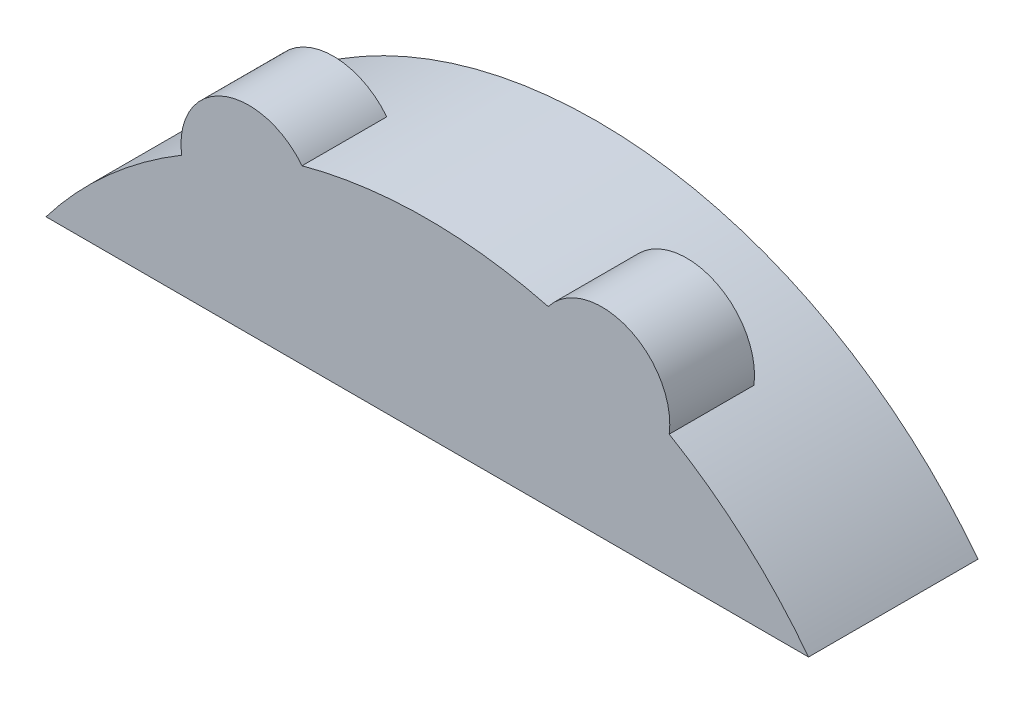
ISO-10303-21;
HEADER;
FILE_DESCRIPTION(('STEP AP214'),'2;1');
FILE_NAME('part.step','',(''),(''),'','','');
FILE_SCHEMA(('AUTOMOTIVE_DESIGN { 1 0 10303 214 1 1 1 1 }'));
ENDSEC;
DATA;
#1=APPLICATION_CONTEXT('core data for automotive mechanical design processes');
#2=APPLICATION_PROTOCOL_DEFINITION('international standard','automotive_design',2000,#1);
#3=PRODUCT_CONTEXT('',#1,'mechanical');
#4=PRODUCT('Part','Part','',(#3));
#5=PRODUCT_RELATED_PRODUCT_CATEGORY('part','',(#4));
#6=PRODUCT_DEFINITION_FORMATION('','',#4);
#7=PRODUCT_DEFINITION_CONTEXT('part definition',#1,'design');
#8=PRODUCT_DEFINITION('design','',#6,#7);
#9=PRODUCT_DEFINITION_SHAPE('','',#8);
#10=(LENGTH_UNIT() NAMED_UNIT(*) SI_UNIT(.MILLI.,.METRE.));
#11=(NAMED_UNIT(*) PLANE_ANGLE_UNIT() SI_UNIT($,.RADIAN.));
#12=(NAMED_UNIT(*) SI_UNIT($,.STERADIAN.) SOLID_ANGLE_UNIT());
#13=UNCERTAINTY_MEASURE_WITH_UNIT(LENGTH_MEASURE(1.E-05),#10,'distance_accuracy_value','');
#14=(GEOMETRIC_REPRESENTATION_CONTEXT(3) GLOBAL_UNCERTAINTY_ASSIGNED_CONTEXT((#13)) GLOBAL_UNIT_ASSIGNED_CONTEXT((#10,
#11,#12)) REPRESENTATION_CONTEXT('',''));
#15=CARTESIAN_POINT('',(0.,0.,0.));
#16=DIRECTION('',(0.,0.,1.));
#17=DIRECTION('',(1.,0.,0.));
#18=AXIS2_PLACEMENT_3D('',#15,#16,#17);
#19=CARTESIAN_POINT('',(5.,0.721726997994755,-20.));
#20=DIRECTION('',(0.,0.,1.));
#21=DIRECTION('',(1.,0.,0.));
#22=AXIS2_PLACEMENT_3D('',#19,#20,#21);
#23=CYLINDRICAL_SURFACE('',#22,56.5685424949238);
#24=DIRECTION('',(0.,0.,1.));
#25=VECTOR('',#24,1.);
#26=CARTESIAN_POINT('',(-9.78201315305642,55.3247680043606,-10.));
#27=LINE('',#26,#25);
#28=CARTESIAN_POINT('',(-9.78201315305642,55.3247680043606,-10.));
#29=VERTEX_POINT('',#28);
#30=CARTESIAN_POINT('',(-9.78201315305642,55.3247680043606,0.));
#31=VERTEX_POINT('',#30);
#32=EDGE_CURVE('E112',#29,#31,#27,.T.);
#33=ORIENTED_EDGE('',*,*,#32,.T.);
#34=CARTESIAN_POINT('',(5.,0.721726997994755,0.));
#35=DIRECTION('',(0.,0.,1.));
#36=DIRECTION('',(-1.,0.,0.));
#37=AXIS2_PLACEMENT_3D('',#34,#35,#36);
#38=CIRCLE('',#37,56.5685424949238);
#39=CARTESIAN_POINT('',(19.2743752444987,55.4596682396897,0.));
#40=VERTEX_POINT('',#39);
#41=EDGE_CURVE('E149',#40,#31,#38,.T.);
#42=ORIENTED_EDGE('',*,*,#41,.F.);
#43=DIRECTION('',(0.,0.,1.));
#44=VECTOR('',#43,1.);
#45=CARTESIAN_POINT('',(19.2743752444987,55.4596682396897,-10.));
#46=LINE('',#45,#44);
#47=CARTESIAN_POINT('',(19.2743752444987,55.4596682396897,-10.));
#48=VERTEX_POINT('',#47);
#49=EDGE_CURVE('E123',#48,#40,#46,.T.);
#50=ORIENTED_EDGE('',*,*,#49,.F.);
#51=CARTESIAN_POINT('',(5.,0.721726997994755,-10.));
#52=DIRECTION('',(0.,0.,-1.));
#53=DIRECTION('',(-1.,0.,0.));
#54=AXIS2_PLACEMENT_3D('',#51,#52,#53);
#55=CIRCLE('',#54,56.5685424949238);
#56=CARTESIAN_POINT('',(33.5561458102995,49.5535458916313,-10.));
#57=VERTEX_POINT('',#56);
#58=EDGE_CURVE('E59',#57,#48,#55,.F.);
#59=ORIENTED_EDGE('',*,*,#58,.F.);
#60=DIRECTION('',(0.,0.,1.));
#61=VECTOR('',#60,1.);
#62=CARTESIAN_POINT('',(33.5561458102995,49.5535458916313,-10.));
#63=LINE('',#62,#61);
#64=CARTESIAN_POINT('',(33.5561458102995,49.5535458916313,0.));
#65=VERTEX_POINT('',#64);
#66=EDGE_CURVE('E127',#57,#65,#63,.T.);
#67=ORIENTED_EDGE('',*,*,#66,.T.);
#68=CARTESIAN_POINT('',(50.,35.,0.));
#69=VERTEX_POINT('',#68);
#70=EDGE_CURVE('E146',#69,#65,#38,.T.);
#71=ORIENTED_EDGE('',*,*,#70,.F.);
#72=DIRECTION('',(0.,0.,1.));
#73=VECTOR('',#72,1.);
#74=CARTESIAN_POINT('',(50.,35.,-20.));
#75=LINE('',#74,#73);
#76=CARTESIAN_POINT('',(50.,35.,-20.));
#77=VERTEX_POINT('',#76);
#78=EDGE_CURVE('E153',#77,#69,#75,.T.);
#79=ORIENTED_EDGE('',*,*,#78,.F.);
#80=CARTESIAN_POINT('',(5.,0.721726997994755,-20.));
#81=DIRECTION('',(0.,0.,1.));
#82=DIRECTION('',(-1.,0.,0.));
#83=AXIS2_PLACEMENT_3D('',#80,#81,#82);
#84=CIRCLE('',#83,56.5685424949238);
#85=CARTESIAN_POINT('',(-40.,35.,-20.));
#86=VERTEX_POINT('',#85);
#87=EDGE_CURVE('E136',#77,#86,#84,.T.);
#88=ORIENTED_EDGE('',*,*,#87,.T.);
#89=DIRECTION('',(0.,0.,1.));
#90=VECTOR('',#89,1.);
#91=CARTESIAN_POINT('',(-40.,35.,-20.));
#92=LINE('',#91,#90);
#93=CARTESIAN_POINT('',(-40.,35.,0.));
#94=VERTEX_POINT('',#93);
#95=EDGE_CURVE('E145',#86,#94,#92,.T.);
#96=ORIENTED_EDGE('',*,*,#95,.T.);
#97=CARTESIAN_POINT('',(-23.9952940760754,49.2940742898635,0.));
#98=VERTEX_POINT('',#97);
#99=EDGE_CURVE('E116',#98,#94,#38,.T.);
#100=ORIENTED_EDGE('',*,*,#99,.F.);
#101=DIRECTION('',(0.,0.,1.));
#102=VECTOR('',#101,1.);
#103=CARTESIAN_POINT('',(-23.9952940760754,49.2940742898635,-10.));
#104=LINE('',#103,#102);
#105=CARTESIAN_POINT('',(-23.9952940760754,49.2940742898635,-10.));
#106=VERTEX_POINT('',#105);
#107=EDGE_CURVE('E110',#106,#98,#104,.T.);
#108=ORIENTED_EDGE('',*,*,#107,.F.);
#109=CARTESIAN_POINT('',(5.,0.721726997994755,-10.));
#110=DIRECTION('',(0.,0.,1.));
#111=DIRECTION('',(1.,0.,0.));
#112=AXIS2_PLACEMENT_3D('',#109,#110,#111);
#113=CIRCLE('',#112,56.5685424949238);
#114=EDGE_CURVE('E11',#106,#29,#113,.F.);
#115=ORIENTED_EDGE('',*,*,#114,.T.);
#116=EDGE_LOOP('',(#33,#42,#50,#59,#67,#71,#79,#88,#96,#100,#108,#115));
#117=FACE_BOUND('',#116,.T.);
#118=ADVANCED_FACE('F51',(#117),#23,.T.);
#119=CARTESIAN_POINT('',(50.,35.,-20.));
#120=DIRECTION('',(0.,-1.,0.));
#121=DIRECTION('',(1.,0.,0.));
#122=AXIS2_PLACEMENT_3D('',#119,#120,#121);
#123=PLANE('',#122);
#124=DIRECTION('',(1.,0.,0.));
#125=VECTOR('',#124,1.);
#126=CARTESIAN_POINT('',(50.,35.,0.));
#127=LINE('',#126,#125);
#128=EDGE_CURVE('E141',#94,#69,#127,.T.);
#129=ORIENTED_EDGE('',*,*,#128,.F.);
#130=ORIENTED_EDGE('',*,*,#95,.F.);
#131=DIRECTION('',(1.,0.,0.));
#132=VECTOR('',#131,1.);
#133=CARTESIAN_POINT('',(50.,35.,-20.));
#134=LINE('',#133,#132);
#135=EDGE_CURVE('E140',#86,#77,#134,.T.);
#136=ORIENTED_EDGE('',*,*,#135,.T.);
#137=ORIENTED_EDGE('',*,*,#78,.T.);
#138=EDGE_LOOP('',(#129,#130,#136,#137));
#139=FACE_BOUND('',#138,.T.);
#140=ADVANCED_FACE('F173',(#139),#123,.T.);
#141=CARTESIAN_POINT('',(5.,0.721726997994755,-20.));
#142=DIRECTION('',(0.,0.,-1.));
#143=DIRECTION('',(-1.,0.,0.));
#144=AXIS2_PLACEMENT_3D('',#141,#142,#143);
#145=PLANE('',#144);
#146=ORIENTED_EDGE('',*,*,#87,.F.);
#147=ORIENTED_EDGE('',*,*,#135,.F.);
#148=EDGE_LOOP('',(#146,#147));
#149=FACE_BOUND('',#148,.T.);
#150=ADVANCED_FACE('F176',(#149),#145,.T.);
#151=CARTESIAN_POINT('',(5.,0.721726997994755,0.));
#152=DIRECTION('',(0.,0.,-1.));
#153=DIRECTION('',(-1.,0.,0.));
#154=AXIS2_PLACEMENT_3D('',#151,#152,#153);
#155=PLANE('',#154);
#156=ORIENTED_EDGE('',*,*,#41,.T.);
#157=CARTESIAN_POINT('',(-16.0690239390168,50.3776986317706,0.));
#158=DIRECTION('',(0.,0.,1.));
#159=DIRECTION('',(1.,0.,0.));
#160=AXIS2_PLACEMENT_3D('',#157,#158,#159);
#161=CIRCLE('',#160,8.);
#162=EDGE_CURVE('E66',#31,#98,#161,.T.);
#163=ORIENTED_EDGE('',*,*,#162,.T.);
#164=ORIENTED_EDGE('',*,*,#99,.T.);
#165=ORIENTED_EDGE('',*,*,#128,.T.);
#166=ORIENTED_EDGE('',*,*,#70,.T.);
#167=CARTESIAN_POINT('',(25.6239901706183,50.593212620864,0.));
#168=DIRECTION('',(0.,0.,1.));
#169=DIRECTION('',(-1.,0.,0.));
#170=AXIS2_PLACEMENT_3D('',#167,#168,#169);
#171=CIRCLE('',#170,8.);
#172=EDGE_CURVE('E72',#65,#40,#171,.T.);
#173=ORIENTED_EDGE('',*,*,#172,.T.);
#174=EDGE_LOOP('',(#156,#163,#164,#165,#166,#173));
#175=FACE_BOUND('',#174,.T.);
#176=ADVANCED_FACE('F168',(#175),#155,.F.);
#177=CARTESIAN_POINT('',(25.6239901706183,50.593212620864,-10.));
#178=DIRECTION('',(0.,0.,1.));
#179=DIRECTION('',(1.,0.,0.));
#180=AXIS2_PLACEMENT_3D('',#177,#178,#179);
#181=CYLINDRICAL_SURFACE('',#180,8.);
#182=ORIENTED_EDGE('',*,*,#172,.F.);
#183=ORIENTED_EDGE('',*,*,#66,.F.);
#184=CARTESIAN_POINT('',(25.6239901706183,50.593212620864,-10.));
#185=DIRECTION('',(0.,0.,1.));
#186=DIRECTION('',(-1.,0.,0.));
#187=AXIS2_PLACEMENT_3D('',#184,#185,#186);
#188=CIRCLE('',#187,8.);
#189=EDGE_CURVE('E126',#57,#48,#188,.T.);
#190=ORIENTED_EDGE('',*,*,#189,.T.);
#191=ORIENTED_EDGE('',*,*,#49,.T.);
#192=EDGE_LOOP('',(#182,#183,#190,#191));
#193=FACE_BOUND('',#192,.T.);
#194=ADVANCED_FACE('F164',(#193),#181,.T.);
#195=CARTESIAN_POINT('',(25.6239901706183,50.593212620864,-10.));
#196=DIRECTION('',(0.,0.,-1.));
#197=DIRECTION('',(-1.,0.,0.));
#198=AXIS2_PLACEMENT_3D('',#195,#196,#197);
#199=PLANE('',#198);
#200=ORIENTED_EDGE('',*,*,#189,.F.);
#201=ORIENTED_EDGE('',*,*,#58,.T.);
#202=EDGE_LOOP('',(#200,#201));
#203=FACE_BOUND('',#202,.T.);
#204=ADVANCED_FACE('F161',(#203),#199,.T.);
#205=CARTESIAN_POINT('',(-16.0690239390168,50.3776986317706,-10.));
#206=DIRECTION('',(0.,0.,1.));
#207=DIRECTION('',(1.,0.,0.));
#208=AXIS2_PLACEMENT_3D('',#205,#206,#207);
#209=CYLINDRICAL_SURFACE('',#208,8.);
#210=ORIENTED_EDGE('',*,*,#162,.F.);
#211=ORIENTED_EDGE('',*,*,#32,.F.);
#212=CARTESIAN_POINT('',(-16.0690239390168,50.3776986317706,-10.));
#213=DIRECTION('',(0.,0.,1.));
#214=DIRECTION('',(1.,0.,0.));
#215=AXIS2_PLACEMENT_3D('',#212,#213,#214);
#216=CIRCLE('',#215,8.);
#217=EDGE_CURVE('E104',#29,#106,#216,.T.);
#218=ORIENTED_EDGE('',*,*,#217,.T.);
#219=ORIENTED_EDGE('',*,*,#107,.T.);
#220=EDGE_LOOP('',(#210,#211,#218,#219));
#221=FACE_BOUND('',#220,.T.);
#222=ADVANCED_FACE('F109',(#221),#209,.T.);
#223=CARTESIAN_POINT('',(-16.0690239390168,50.3776986317706,-10.));
#224=DIRECTION('',(0.,0.,1.));
#225=DIRECTION('',(1.,0.,0.));
#226=AXIS2_PLACEMENT_3D('',#223,#224,#225);
#227=PLANE('',#226);
#228=ORIENTED_EDGE('',*,*,#114,.F.);
#229=ORIENTED_EDGE('',*,*,#217,.F.);
#230=EDGE_LOOP('',(#228,#229));
#231=FACE_BOUND('',#230,.T.);
#232=ADVANCED_FACE('F103',(#231),#227,.F.);
#233=CLOSED_SHELL('',(#118,#140,#150,#176,#194,#204,#222,#232));
#234=MANIFOLD_SOLID_BREP('B2',#233);
#235=ADVANCED_BREP_SHAPE_REPRESENTATION('',(#18,#234),#14);
#236=SHAPE_DEFINITION_REPRESENTATION(#9,#235);
ENDSEC;
END-ISO-10303-21;
